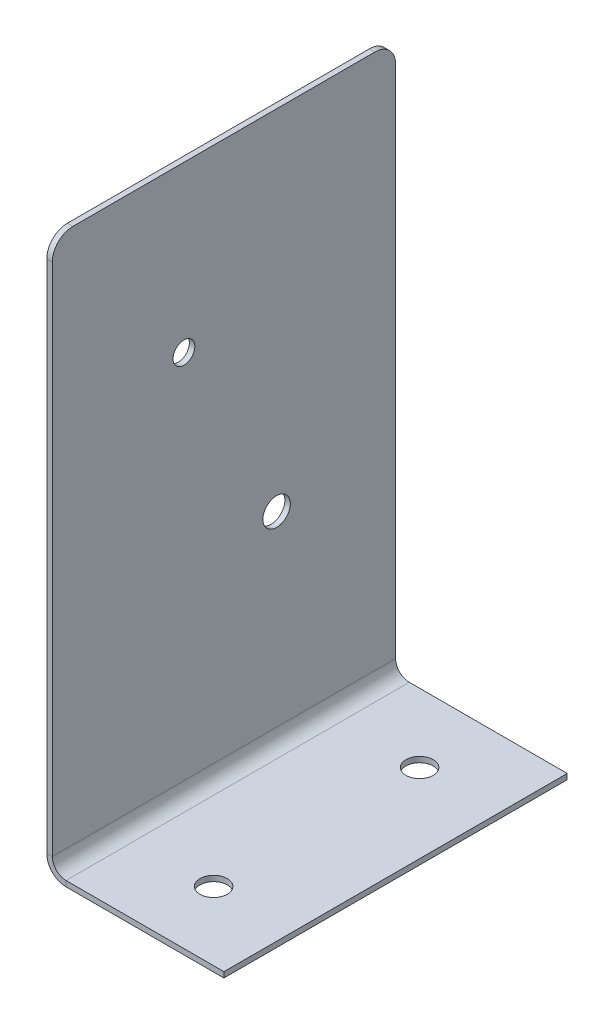
ISO-10303-21;
HEADER;
FILE_DESCRIPTION(('STEP AP214'),'2;1');
FILE_NAME('part.step','',(''),(''),'','','');
FILE_SCHEMA(('AUTOMOTIVE_DESIGN { 1 0 10303 214 1 1 1 1 }'));
ENDSEC;
DATA;
#1=APPLICATION_CONTEXT('core data for automotive mechanical design processes');
#2=APPLICATION_PROTOCOL_DEFINITION('international standard','automotive_design',2000,#1);
#3=PRODUCT_CONTEXT('',#1,'mechanical');
#4=PRODUCT('Part','Part','',(#3));
#5=PRODUCT_RELATED_PRODUCT_CATEGORY('part','',(#4));
#6=PRODUCT_DEFINITION_FORMATION('','',#4);
#7=PRODUCT_DEFINITION_CONTEXT('part definition',#1,'design');
#8=PRODUCT_DEFINITION('design','',#6,#7);
#9=PRODUCT_DEFINITION_SHAPE('','',#8);
#10=(LENGTH_UNIT() NAMED_UNIT(*) SI_UNIT(.MILLI.,.METRE.));
#11=(NAMED_UNIT(*) PLANE_ANGLE_UNIT() SI_UNIT($,.RADIAN.));
#12=(NAMED_UNIT(*) SI_UNIT($,.STERADIAN.) SOLID_ANGLE_UNIT());
#13=UNCERTAINTY_MEASURE_WITH_UNIT(LENGTH_MEASURE(1.E-05),#10,'distance_accuracy_value','');
#14=(GEOMETRIC_REPRESENTATION_CONTEXT(3) GLOBAL_UNCERTAINTY_ASSIGNED_CONTEXT((#13)) GLOBAL_UNIT_ASSIGNED_CONTEXT((#10,
#11,#12)) REPRESENTATION_CONTEXT('',''));
#15=CARTESIAN_POINT('',(0.,0.,0.));
#16=DIRECTION('',(0.,0.,1.));
#17=DIRECTION('',(1.,0.,0.));
#18=AXIS2_PLACEMENT_3D('',#15,#16,#17);
#19=CARTESIAN_POINT('',(2.,0.,25.));
#20=DIRECTION('',(0.,0.,1.));
#21=DIRECTION('',(1.,0.,0.));
#22=AXIS2_PLACEMENT_3D('',#19,#20,#21);
#23=PLANE('',#22);
#24=DIRECTION('',(0.,-1.,0.));
#25=VECTOR('',#24,1.);
#26=CARTESIAN_POINT('',(2.,0.,25.));
#27=LINE('',#26,#25);
#28=CARTESIAN_POINT('',(2.,0.,25.));
#29=VERTEX_POINT('',#28);
#30=CARTESIAN_POINT('',(2.,-0.8,25.));
#31=VERTEX_POINT('',#30);
#32=EDGE_CURVE('E197',#29,#31,#27,.T.);
#33=ORIENTED_EDGE('',*,*,#32,.F.);
#34=CARTESIAN_POINT('',(2.,2.,25.));
#35=DIRECTION('',(0.,0.,-1.));
#36=DIRECTION('',(-1.,0.,0.));
#37=AXIS2_PLACEMENT_3D('',#34,#35,#36);
#38=CIRCLE('',#37,2.);
#39=CARTESIAN_POINT('',(0.,2.,25.));
#40=VERTEX_POINT('',#39);
#41=EDGE_CURVE('E165',#40,#29,#38,.F.);
#42=ORIENTED_EDGE('',*,*,#41,.F.);
#43=DIRECTION('',(1.,0.,0.));
#44=VECTOR('',#43,1.);
#45=CARTESIAN_POINT('',(-0.799999999999995,2.,25.));
#46=LINE('',#45,#44);
#47=CARTESIAN_POINT('',(-0.799999999999995,2.,25.));
#48=VERTEX_POINT('',#47);
#49=EDGE_CURVE('E194',#48,#40,#46,.T.);
#50=ORIENTED_EDGE('',*,*,#49,.F.);
#51=CARTESIAN_POINT('',(2.,2.,25.));
#52=DIRECTION('',(0.,0.,1.));
#53=DIRECTION('',(1.,0.,0.));
#54=AXIS2_PLACEMENT_3D('',#51,#52,#53);
#55=CIRCLE('',#54,2.8);
#56=EDGE_CURVE('E172',#48,#31,#55,.T.);
#57=ORIENTED_EDGE('',*,*,#56,.T.);
#58=EDGE_LOOP('',(#33,#42,#50,#57));
#59=FACE_BOUND('',#58,.T.);
#60=ADVANCED_FACE('F38',(#59),#23,.T.);
#61=CARTESIAN_POINT('',(-0.799999999999995,2.,25.));
#62=DIRECTION('',(0.,0.,1.));
#63=DIRECTION('',(1.,0.,0.));
#64=AXIS2_PLACEMENT_3D('',#61,#62,#63);
#65=PLANE('',#64);
#66=DIRECTION('',(1.,0.,0.));
#67=VECTOR('',#66,1.);
#68=CARTESIAN_POINT('',(0.,0.,25.));
#69=LINE('',#68,#67);
#70=CARTESIAN_POINT('',(25.,0.,25.));
#71=VERTEX_POINT('',#70);
#72=EDGE_CURVE('E162',#29,#71,#69,.T.);
#73=ORIENTED_EDGE('',*,*,#72,.F.);
#74=ORIENTED_EDGE('',*,*,#32,.T.);
#75=DIRECTION('',(1.,0.,0.));
#76=VECTOR('',#75,1.);
#77=CARTESIAN_POINT('',(0.,-0.8,25.));
#78=LINE('',#77,#76);
#79=CARTESIAN_POINT('',(25.,-0.8,25.));
#80=VERTEX_POINT('',#79);
#81=EDGE_CURVE('E159',#31,#80,#78,.T.);
#82=ORIENTED_EDGE('',*,*,#81,.T.);
#83=DIRECTION('',(0.,-1.,0.));
#84=VECTOR('',#83,1.);
#85=CARTESIAN_POINT('',(25.,0.,25.));
#86=LINE('',#85,#84);
#87=EDGE_CURVE('E122',#71,#80,#86,.T.);
#88=ORIENTED_EDGE('',*,*,#87,.F.);
#89=EDGE_LOOP('',(#73,#74,#82,#88));
#90=FACE_BOUND('',#89,.T.);
#91=ADVANCED_FACE('F244',(#90),#65,.T.);
#92=CARTESIAN_POINT('',(0.,2.,-25.));
#93=DIRECTION('',(0.,0.,-1.));
#94=DIRECTION('',(-1.,0.,0.));
#95=AXIS2_PLACEMENT_3D('',#92,#93,#94);
#96=PLANE('',#95);
#97=DIRECTION('',(-1.,0.,0.));
#98=VECTOR('',#97,1.);
#99=CARTESIAN_POINT('',(0.,2.,-25.));
#100=LINE('',#99,#98);
#101=CARTESIAN_POINT('',(0.,2.,-25.));
#102=VERTEX_POINT('',#101);
#103=CARTESIAN_POINT('',(-0.800000000000002,2.,-25.));
#104=VERTEX_POINT('',#103);
#105=EDGE_CURVE('E191',#102,#104,#100,.T.);
#106=ORIENTED_EDGE('',*,*,#105,.F.);
#107=CARTESIAN_POINT('',(2.,2.,-25.));
#108=DIRECTION('',(0.,0.,-1.));
#109=DIRECTION('',(-1.,0.,0.));
#110=AXIS2_PLACEMENT_3D('',#107,#108,#109);
#111=CIRCLE('',#110,2.);
#112=CARTESIAN_POINT('',(2.,0.,-25.));
#113=VERTEX_POINT('',#112);
#114=EDGE_CURVE('E150',#102,#113,#111,.F.);
#115=ORIENTED_EDGE('',*,*,#114,.T.);
#116=DIRECTION('',(0.,1.,0.));
#117=VECTOR('',#116,1.);
#118=CARTESIAN_POINT('',(2.,-0.8,-25.));
#119=LINE('',#118,#117);
#120=CARTESIAN_POINT('',(2.,-0.8,-25.));
#121=VERTEX_POINT('',#120);
#122=EDGE_CURVE('E126',#121,#113,#119,.T.);
#123=ORIENTED_EDGE('',*,*,#122,.F.);
#124=CARTESIAN_POINT('',(2.,2.,-25.));
#125=DIRECTION('',(0.,0.,1.));
#126=DIRECTION('',(1.,0.,0.));
#127=AXIS2_PLACEMENT_3D('',#124,#125,#126);
#128=CIRCLE('',#127,2.8);
#129=EDGE_CURVE('E157',#104,#121,#128,.T.);
#130=ORIENTED_EDGE('',*,*,#129,.F.);
#131=EDGE_LOOP('',(#106,#115,#123,#130));
#132=FACE_BOUND('',#131,.T.);
#133=ADVANCED_FACE('F246',(#132),#96,.T.);
#134=CARTESIAN_POINT('',(2.,-0.8,-25.));
#135=DIRECTION('',(0.,0.,-1.));
#136=DIRECTION('',(-1.,0.,0.));
#137=AXIS2_PLACEMENT_3D('',#134,#135,#136);
#138=PLANE('',#137);
#139=DIRECTION('',(0.,-1.,0.));
#140=VECTOR('',#139,1.);
#141=CARTESIAN_POINT('',(-0.800000000000002,80.,-25.));
#142=LINE('',#141,#140);
#143=CARTESIAN_POINT('',(-0.800000000000009,77.,-25.0000000000001));
#144=VERTEX_POINT('',#143);
#145=EDGE_CURVE('E155',#144,#104,#142,.T.);
#146=ORIENTED_EDGE('',*,*,#145,.F.);
#147=DIRECTION('',(1.,0.,0.));
#148=VECTOR('',#147,1.);
#149=CARTESIAN_POINT('',(2.,77.,-25.0000000000001));
#150=LINE('',#149,#148);
#151=CARTESIAN_POINT('',(0.,77.,-25.0000000000001));
#152=VERTEX_POINT('',#151);
#153=EDGE_CURVE('E199',#144,#152,#150,.T.);
#154=ORIENTED_EDGE('',*,*,#153,.T.);
#155=DIRECTION('',(0.,-1.,0.));
#156=VECTOR('',#155,1.);
#157=CARTESIAN_POINT('',(0.,80.,-25.));
#158=LINE('',#157,#156);
#159=EDGE_CURVE('E153',#152,#102,#158,.T.);
#160=ORIENTED_EDGE('',*,*,#159,.T.);
#161=ORIENTED_EDGE('',*,*,#105,.T.);
#162=EDGE_LOOP('',(#146,#154,#160,#161));
#163=FACE_BOUND('',#162,.T.);
#164=ADVANCED_FACE('F219',(#163),#138,.T.);
#165=CARTESIAN_POINT('',(0.,-0.8,25.));
#166=DIRECTION('',(0.,1.,0.));
#167=DIRECTION('',(0.,0.,1.));
#168=AXIS2_PLACEMENT_3D('',#165,#166,#167);
#169=PLANE('',#168);
#170=CARTESIAN_POINT('',(13.5,-0.800000000000001,15.));
#171=DIRECTION('',(0.,1.,0.));
#172=DIRECTION('',(0.,0.,1.));
#173=AXIS2_PLACEMENT_3D('',#170,#171,#172);
#174=CIRCLE('',#173,1.984375);
#175=CARTESIAN_POINT('',(13.5,-0.800000000000001,16.984375));
#176=VERTEX_POINT('',#175);
#177=EDGE_CURVE('E460',#176,#176,#174,.T.);
#178=ORIENTED_EDGE('',*,*,#177,.T.);
#179=EDGE_LOOP('',(#178));
#180=FACE_BOUND('',#179,.T.);
#181=CARTESIAN_POINT('',(13.5,-0.8,-15.));
#182=DIRECTION('',(0.,1.,0.));
#183=DIRECTION('',(0.,0.,1.));
#184=AXIS2_PLACEMENT_3D('',#181,#182,#183);
#185=CIRCLE('',#184,1.984375);
#186=CARTESIAN_POINT('',(13.5,-0.8,-13.015625));
#187=VERTEX_POINT('',#186);
#188=EDGE_CURVE('E463',#187,#187,#185,.T.);
#189=ORIENTED_EDGE('',*,*,#188,.T.);
#190=EDGE_LOOP('',(#189));
#191=FACE_BOUND('',#190,.T.);
#192=DIRECTION('',(0.,0.,-1.));
#193=VECTOR('',#192,1.);
#194=CARTESIAN_POINT('',(2.,-0.8,25.));
#195=LINE('',#194,#193);
#196=EDGE_CURVE('E141',#31,#121,#195,.T.);
#197=ORIENTED_EDGE('',*,*,#196,.T.);
#198=DIRECTION('',(1.,0.,0.));
#199=VECTOR('',#198,1.);
#200=CARTESIAN_POINT('',(0.,-0.8,-25.));
#201=LINE('',#200,#199);
#202=CARTESIAN_POINT('',(25.,-0.8,-25.));
#203=VERTEX_POINT('',#202);
#204=EDGE_CURVE('E133',#121,#203,#201,.T.);
#205=ORIENTED_EDGE('',*,*,#204,.T.);
#206=DIRECTION('',(0.,0.,-1.));
#207=VECTOR('',#206,1.);
#208=CARTESIAN_POINT('',(25.,-0.8,25.));
#209=LINE('',#208,#207);
#210=EDGE_CURVE('E117',#80,#203,#209,.T.);
#211=ORIENTED_EDGE('',*,*,#210,.F.);
#212=ORIENTED_EDGE('',*,*,#81,.F.);
#213=EDGE_LOOP('',(#197,#205,#211,#212));
#214=FACE_BOUND('',#213,.T.);
#215=ADVANCED_FACE('F139',(#180,#191,#214),#169,.F.);
#216=CARTESIAN_POINT('',(25.,0.,25.));
#217=DIRECTION('',(1.,0.,0.));
#218=DIRECTION('',(0.,0.,-1.));
#219=AXIS2_PLACEMENT_3D('',#216,#217,#218);
#220=PLANE('',#219);
#221=ORIENTED_EDGE('',*,*,#210,.T.);
#222=DIRECTION('',(0.,-1.,0.));
#223=VECTOR('',#222,1.);
#224=CARTESIAN_POINT('',(25.,0.,-25.0000000000001));
#225=LINE('',#224,#223);
#226=CARTESIAN_POINT('',(25.,0.,-25.0000000000001));
#227=VERTEX_POINT('',#226);
#228=EDGE_CURVE('E120',#227,#203,#225,.T.);
#229=ORIENTED_EDGE('',*,*,#228,.F.);
#230=DIRECTION('',(0.,0.,-1.));
#231=VECTOR('',#230,1.);
#232=CARTESIAN_POINT('',(25.,0.,25.));
#233=LINE('',#232,#231);
#234=EDGE_CURVE('E127',#71,#227,#233,.T.);
#235=ORIENTED_EDGE('',*,*,#234,.F.);
#236=ORIENTED_EDGE('',*,*,#87,.T.);
#237=EDGE_LOOP('',(#221,#229,#235,#236));
#238=FACE_BOUND('',#237,.T.);
#239=ADVANCED_FACE('F119',(#238),#220,.T.);
#240=CARTESIAN_POINT('',(0.,0.,25.));
#241=DIRECTION('',(0.,1.,0.));
#242=DIRECTION('',(0.,0.,1.));
#243=AXIS2_PLACEMENT_3D('',#240,#241,#242);
#244=PLANE('',#243);
#245=CARTESIAN_POINT('',(13.5,0.,15.));
#246=DIRECTION('',(0.,1.,0.));
#247=DIRECTION('',(0.,0.,1.));
#248=AXIS2_PLACEMENT_3D('',#245,#246,#247);
#249=CIRCLE('',#248,1.984375);
#250=CARTESIAN_POINT('',(13.5,0.,16.984375));
#251=VERTEX_POINT('',#250);
#252=EDGE_CURVE('E486',#251,#251,#249,.T.);
#253=ORIENTED_EDGE('',*,*,#252,.F.);
#254=EDGE_LOOP('',(#253));
#255=FACE_BOUND('',#254,.T.);
#256=CARTESIAN_POINT('',(13.5,0.,-15.));
#257=DIRECTION('',(0.,1.,0.));
#258=DIRECTION('',(0.,0.,1.));
#259=AXIS2_PLACEMENT_3D('',#256,#257,#258);
#260=CIRCLE('',#259,1.984375);
#261=CARTESIAN_POINT('',(13.5,0.,-13.015625));
#262=VERTEX_POINT('',#261);
#263=EDGE_CURVE('E466',#262,#262,#260,.T.);
#264=ORIENTED_EDGE('',*,*,#263,.F.);
#265=EDGE_LOOP('',(#264));
#266=FACE_BOUND('',#265,.T.);
#267=ORIENTED_EDGE('',*,*,#234,.T.);
#268=DIRECTION('',(1.,0.,0.));
#269=VECTOR('',#268,1.);
#270=CARTESIAN_POINT('',(0.,0.,-25.));
#271=LINE('',#270,#269);
#272=EDGE_CURVE('E136',#113,#227,#271,.T.);
#273=ORIENTED_EDGE('',*,*,#272,.F.);
#274=DIRECTION('',(0.,0.,-1.));
#275=VECTOR('',#274,1.);
#276=CARTESIAN_POINT('',(2.,0.,25.));
#277=LINE('',#276,#275);
#278=EDGE_CURVE('E186',#29,#113,#277,.T.);
#279=ORIENTED_EDGE('',*,*,#278,.F.);
#280=ORIENTED_EDGE('',*,*,#72,.T.);
#281=EDGE_LOOP('',(#267,#273,#279,#280));
#282=FACE_BOUND('',#281,.T.);
#283=ADVANCED_FACE('F243',(#255,#266,#282),#244,.T.);
#284=CARTESIAN_POINT('',(2.,2.,25.));
#285=DIRECTION('',(0.,0.,-1.));
#286=DIRECTION('',(-1.,0.,0.));
#287=AXIS2_PLACEMENT_3D('',#284,#285,#286);
#288=CYLINDRICAL_SURFACE('',#287,2.);
#289=ORIENTED_EDGE('',*,*,#278,.T.);
#290=ORIENTED_EDGE('',*,*,#114,.F.);
#291=DIRECTION('',(0.,0.,-1.));
#292=VECTOR('',#291,1.);
#293=CARTESIAN_POINT('',(0.,2.,25.));
#294=LINE('',#293,#292);
#295=EDGE_CURVE('E183',#40,#102,#294,.T.);
#296=ORIENTED_EDGE('',*,*,#295,.F.);
#297=ORIENTED_EDGE('',*,*,#41,.T.);
#298=EDGE_LOOP('',(#289,#290,#296,#297));
#299=FACE_BOUND('',#298,.T.);
#300=ADVANCED_FACE('F237',(#299),#288,.F.);
#301=CARTESIAN_POINT('',(0.,80.,25.0000000000001));
#302=DIRECTION('',(1.,0.,0.));
#303=DIRECTION('',(0.,1.,0.));
#304=AXIS2_PLACEMENT_3D('',#301,#302,#303);
#305=PLANE('',#304);
#306=CARTESIAN_POINT('',(0.,29.2,-7.67597901866867));
#307=DIRECTION('',(1.,0.,0.));
#308=DIRECTION('',(0.,1.,0.));
#309=AXIS2_PLACEMENT_3D('',#306,#307,#308);
#310=CIRCLE('',#309,2.);
#311=CARTESIAN_POINT('',(0.,31.2,-7.67597901866867));
#312=VERTEX_POINT('',#311);
#313=EDGE_CURVE('E465',#312,#312,#310,.T.);
#314=ORIENTED_EDGE('',*,*,#313,.F.);
#315=EDGE_LOOP('',(#314));
#316=FACE_BOUND('',#315,.T.);
#317=CARTESIAN_POINT('',(0.,55.9908566492376,5.82402098133134));
#318=DIRECTION('',(1.,0.,0.));
#319=DIRECTION('',(0.,1.,0.));
#320=AXIS2_PLACEMENT_3D('',#317,#318,#319);
#321=CIRCLE('',#320,1.5875);
#322=CARTESIAN_POINT('',(0.,57.5783566492376,5.82402098133134));
#323=VERTEX_POINT('',#322);
#324=EDGE_CURVE('E145',#323,#323,#321,.T.);
#325=ORIENTED_EDGE('',*,*,#324,.F.);
#326=EDGE_LOOP('',(#325));
#327=FACE_BOUND('',#326,.T.);
#328=ORIENTED_EDGE('',*,*,#159,.F.);
#329=CARTESIAN_POINT('',(0.,77.,-22.));
#330=DIRECTION('',(1.,0.,0.));
#331=DIRECTION('',(0.,1.,0.));
#332=AXIS2_PLACEMENT_3D('',#329,#330,#331);
#333=CIRCLE('',#332,3.);
#334=CARTESIAN_POINT('',(0.,80.,-22.));
#335=VERTEX_POINT('',#334);
#336=EDGE_CURVE('E204',#152,#335,#333,.T.);
#337=ORIENTED_EDGE('',*,*,#336,.T.);
#338=DIRECTION('',(0.,0.,-1.));
#339=VECTOR('',#338,1.);
#340=CARTESIAN_POINT('',(0.,80.,25.0000000000001));
#341=LINE('',#340,#339);
#342=CARTESIAN_POINT('',(0.,80.,22.));
#343=VERTEX_POINT('',#342);
#344=EDGE_CURVE('E181',#343,#335,#341,.T.);
#345=ORIENTED_EDGE('',*,*,#344,.F.);
#346=CARTESIAN_POINT('',(0.,77.,22.));
#347=DIRECTION('',(1.,0.,0.));
#348=DIRECTION('',(0.,1.,0.));
#349=AXIS2_PLACEMENT_3D('',#346,#347,#348);
#350=CIRCLE('',#349,3.);
#351=CARTESIAN_POINT('',(0.,77.,25.));
#352=VERTEX_POINT('',#351);
#353=EDGE_CURVE('E202',#343,#352,#350,.T.);
#354=ORIENTED_EDGE('',*,*,#353,.T.);
#355=DIRECTION('',(0.,-1.,0.));
#356=VECTOR('',#355,1.);
#357=CARTESIAN_POINT('',(0.,80.,25.0000000000001));
#358=LINE('',#357,#356);
#359=EDGE_CURVE('E168',#352,#40,#358,.T.);
#360=ORIENTED_EDGE('',*,*,#359,.T.);
#361=ORIENTED_EDGE('',*,*,#295,.T.);
#362=EDGE_LOOP('',(#328,#337,#345,#354,#360,#361));
#363=FACE_BOUND('',#362,.T.);
#364=ADVANCED_FACE('F225',(#316,#327,#363),#305,.T.);
#365=CARTESIAN_POINT('',(-0.800000000000009,80.,25.));
#366=DIRECTION('',(0.,1.,0.));
#367=DIRECTION('',(0.,0.,1.));
#368=AXIS2_PLACEMENT_3D('',#365,#366,#367);
#369=PLANE('',#368);
#370=ORIENTED_EDGE('',*,*,#344,.T.);
#371=DIRECTION('',(1.,0.,0.));
#372=VECTOR('',#371,1.);
#373=CARTESIAN_POINT('',(-0.800000000000002,80.,-22.));
#374=LINE('',#373,#372);
#375=CARTESIAN_POINT('',(-0.800000000000002,80.,-22.));
#376=VERTEX_POINT('',#375);
#377=EDGE_CURVE('E59',#335,#376,#374,.F.);
#378=ORIENTED_EDGE('',*,*,#377,.T.);
#379=DIRECTION('',(0.,0.,-1.));
#380=VECTOR('',#379,1.);
#381=CARTESIAN_POINT('',(-0.800000000000009,80.,25.));
#382=LINE('',#381,#380);
#383=CARTESIAN_POINT('',(-0.800000000000009,80.,22.));
#384=VERTEX_POINT('',#383);
#385=EDGE_CURVE('E179',#384,#376,#382,.T.);
#386=ORIENTED_EDGE('',*,*,#385,.F.);
#387=DIRECTION('',(1.,0.,0.));
#388=VECTOR('',#387,1.);
#389=CARTESIAN_POINT('',(0.,80.,22.));
#390=LINE('',#389,#388);
#391=EDGE_CURVE('E206',#384,#343,#390,.T.);
#392=ORIENTED_EDGE('',*,*,#391,.T.);
#393=EDGE_LOOP('',(#370,#378,#386,#392));
#394=FACE_BOUND('',#393,.T.);
#395=ADVANCED_FACE('F226',(#394),#369,.T.);
#396=CARTESIAN_POINT('',(-0.800000000000009,80.,25.));
#397=DIRECTION('',(1.,0.,0.));
#398=DIRECTION('',(0.,1.,0.));
#399=AXIS2_PLACEMENT_3D('',#396,#397,#398);
#400=PLANE('',#399);
#401=CARTESIAN_POINT('',(-0.800000000000009,29.2,-7.67597901866867));
#402=DIRECTION('',(1.,0.,0.));
#403=DIRECTION('',(0.,1.,0.));
#404=AXIS2_PLACEMENT_3D('',#401,#402,#403);
#405=CIRCLE('',#404,2.);
#406=CARTESIAN_POINT('',(-0.800000000000009,31.2,-7.67597901866867));
#407=VERTEX_POINT('',#406);
#408=EDGE_CURVE('E469',#407,#407,#405,.T.);
#409=ORIENTED_EDGE('',*,*,#408,.T.);
#410=EDGE_LOOP('',(#409));
#411=FACE_BOUND('',#410,.T.);
#412=CARTESIAN_POINT('',(-0.800000000000016,55.9908566492376,5.82402098133134));
#413=DIRECTION('',(1.,0.,0.));
#414=DIRECTION('',(0.,1.,0.));
#415=AXIS2_PLACEMENT_3D('',#412,#413,#414);
#416=CIRCLE('',#415,1.5875);
#417=CARTESIAN_POINT('',(-0.800000000000016,57.5783566492376,5.82402098133134));
#418=VERTEX_POINT('',#417);
#419=EDGE_CURVE('E142',#418,#418,#416,.T.);
#420=ORIENTED_EDGE('',*,*,#419,.T.);
#421=EDGE_LOOP('',(#420));
#422=FACE_BOUND('',#421,.T.);
#423=ORIENTED_EDGE('',*,*,#385,.T.);
#424=CARTESIAN_POINT('',(-0.800000000000009,77.,-22.));
#425=DIRECTION('',(1.,0.,0.));
#426=DIRECTION('',(0.,1.,0.));
#427=AXIS2_PLACEMENT_3D('',#424,#425,#426);
#428=CIRCLE('',#427,3.);
#429=EDGE_CURVE('E46',#376,#144,#428,.F.);
#430=ORIENTED_EDGE('',*,*,#429,.T.);
#431=ORIENTED_EDGE('',*,*,#145,.T.);
#432=DIRECTION('',(0.,0.,-1.));
#433=VECTOR('',#432,1.);
#434=CARTESIAN_POINT('',(-0.799999999999995,2.,25.));
#435=LINE('',#434,#433);
#436=EDGE_CURVE('E176',#48,#104,#435,.T.);
#437=ORIENTED_EDGE('',*,*,#436,.F.);
#438=DIRECTION('',(0.,-1.,0.));
#439=VECTOR('',#438,1.);
#440=CARTESIAN_POINT('',(-0.800000000000009,80.,25.));
#441=LINE('',#440,#439);
#442=CARTESIAN_POINT('',(-0.800000000000002,77.,25.));
#443=VERTEX_POINT('',#442);
#444=EDGE_CURVE('E170',#443,#48,#441,.T.);
#445=ORIENTED_EDGE('',*,*,#444,.F.);
#446=CARTESIAN_POINT('',(-0.800000000000002,77.,22.));
#447=DIRECTION('',(1.,0.,0.));
#448=DIRECTION('',(0.,1.,0.));
#449=AXIS2_PLACEMENT_3D('',#446,#447,#448);
#450=CIRCLE('',#449,3.);
#451=EDGE_CURVE('E210',#443,#384,#450,.F.);
#452=ORIENTED_EDGE('',*,*,#451,.T.);
#453=EDGE_LOOP('',(#423,#430,#431,#437,#445,#452));
#454=FACE_BOUND('',#453,.T.);
#455=ADVANCED_FACE('F214',(#411,#422,#454),#400,.F.);
#456=CARTESIAN_POINT('',(2.,2.,25.));
#457=DIRECTION('',(0.,0.,-1.));
#458=DIRECTION('',(-1.,0.,0.));
#459=AXIS2_PLACEMENT_3D('',#456,#457,#458);
#460=CYLINDRICAL_SURFACE('',#459,2.8);
#461=ORIENTED_EDGE('',*,*,#436,.T.);
#462=ORIENTED_EDGE('',*,*,#129,.T.);
#463=ORIENTED_EDGE('',*,*,#196,.F.);
#464=ORIENTED_EDGE('',*,*,#56,.F.);
#465=EDGE_LOOP('',(#461,#462,#463,#464));
#466=FACE_BOUND('',#465,.T.);
#467=ADVANCED_FACE('F285',(#466),#460,.T.);
#468=CARTESIAN_POINT('',(2.,2.,25.));
#469=DIRECTION('',(0.,0.,-1.));
#470=DIRECTION('',(-1.,0.,0.));
#471=AXIS2_PLACEMENT_3D('',#468,#469,#470);
#472=PLANE('',#471);
#473=ORIENTED_EDGE('',*,*,#359,.F.);
#474=DIRECTION('',(1.,0.,0.));
#475=VECTOR('',#474,1.);
#476=CARTESIAN_POINT('',(-0.800000000000002,77.,25.));
#477=LINE('',#476,#475);
#478=EDGE_CURVE('E11',#352,#443,#477,.F.);
#479=ORIENTED_EDGE('',*,*,#478,.T.);
#480=ORIENTED_EDGE('',*,*,#444,.T.);
#481=ORIENTED_EDGE('',*,*,#49,.T.);
#482=EDGE_LOOP('',(#473,#479,#480,#481));
#483=FACE_BOUND('',#482,.T.);
#484=ADVANCED_FACE('F230',(#483),#472,.F.);
#485=CARTESIAN_POINT('',(2.,2.,-25.));
#486=DIRECTION('',(0.,0.,-1.));
#487=DIRECTION('',(-1.,0.,0.));
#488=AXIS2_PLACEMENT_3D('',#485,#486,#487);
#489=PLANE('',#488);
#490=ORIENTED_EDGE('',*,*,#204,.F.);
#491=ORIENTED_EDGE('',*,*,#122,.T.);
#492=ORIENTED_EDGE('',*,*,#272,.T.);
#493=ORIENTED_EDGE('',*,*,#228,.T.);
#494=EDGE_LOOP('',(#490,#491,#492,#493));
#495=FACE_BOUND('',#494,.T.);
#496=ADVANCED_FACE('F132',(#495),#489,.T.);
#497=CARTESIAN_POINT('',(-0.800000000000016,55.9908566492376,5.82402098133134));
#498=DIRECTION('',(1.,0.,0.));
#499=DIRECTION('',(0.,1.,0.));
#500=AXIS2_PLACEMENT_3D('',#497,#498,#499);
#501=CYLINDRICAL_SURFACE('',#500,1.5875);
#502=ORIENTED_EDGE('',*,*,#419,.F.);
#503=EDGE_LOOP('',(#502));
#504=FACE_BOUND('',#503,.T.);
#505=ORIENTED_EDGE('',*,*,#324,.T.);
#506=EDGE_LOOP('',(#505));
#507=FACE_BOUND('',#506,.T.);
#508=ADVANCED_FACE('F276',(#504,#507),#501,.F.);
#509=CARTESIAN_POINT('',(-0.800000000000009,29.2,-7.67597901866867));
#510=DIRECTION('',(1.,0.,0.));
#511=DIRECTION('',(0.,1.,0.));
#512=AXIS2_PLACEMENT_3D('',#509,#510,#511);
#513=CYLINDRICAL_SURFACE('',#512,2.);
#514=ORIENTED_EDGE('',*,*,#408,.F.);
#515=EDGE_LOOP('',(#514));
#516=FACE_BOUND('',#515,.T.);
#517=ORIENTED_EDGE('',*,*,#313,.T.);
#518=EDGE_LOOP('',(#517));
#519=FACE_BOUND('',#518,.T.);
#520=ADVANCED_FACE('F268',(#516,#519),#513,.F.);
#521=CARTESIAN_POINT('',(13.5,-10.,-15.));
#522=DIRECTION('',(0.,1.,0.));
#523=DIRECTION('',(0.,0.,1.));
#524=AXIS2_PLACEMENT_3D('',#521,#522,#523);
#525=CYLINDRICAL_SURFACE('',#524,1.984375);
#526=ORIENTED_EDGE('',*,*,#263,.T.);
#527=EDGE_LOOP('',(#526));
#528=FACE_BOUND('',#527,.T.);
#529=ORIENTED_EDGE('',*,*,#188,.F.);
#530=EDGE_LOOP('',(#529));
#531=FACE_BOUND('',#530,.T.);
#532=ADVANCED_FACE('F262',(#528,#531),#525,.F.);
#533=CARTESIAN_POINT('',(13.5,-10.,15.));
#534=DIRECTION('',(0.,1.,0.));
#535=DIRECTION('',(0.,0.,1.));
#536=AXIS2_PLACEMENT_3D('',#533,#534,#535);
#537=CYLINDRICAL_SURFACE('',#536,1.984375);
#538=ORIENTED_EDGE('',*,*,#252,.T.);
#539=EDGE_LOOP('',(#538));
#540=FACE_BOUND('',#539,.T.);
#541=ORIENTED_EDGE('',*,*,#177,.F.);
#542=EDGE_LOOP('',(#541));
#543=FACE_BOUND('',#542,.T.);
#544=ADVANCED_FACE('F257',(#540,#543),#537,.F.);
#545=CARTESIAN_POINT('',(2.,77.,-22.));
#546=DIRECTION('',(1.,0.,0.));
#547=DIRECTION('',(0.,0.,-1.));
#548=AXIS2_PLACEMENT_3D('',#545,#546,#547);
#549=CYLINDRICAL_SURFACE('',#548,3.);
#550=ORIENTED_EDGE('',*,*,#429,.F.);
#551=ORIENTED_EDGE('',*,*,#377,.F.);
#552=ORIENTED_EDGE('',*,*,#336,.F.);
#553=ORIENTED_EDGE('',*,*,#153,.F.);
#554=EDGE_LOOP('',(#550,#551,#552,#553));
#555=FACE_BOUND('',#554,.T.);
#556=ADVANCED_FACE('F222',(#555),#549,.T.);
#557=CARTESIAN_POINT('',(-0.800000000000002,77.,22.));
#558=DIRECTION('',(-1.,0.,0.));
#559=DIRECTION('',(0.,0.,1.));
#560=AXIS2_PLACEMENT_3D('',#557,#558,#559);
#561=CYLINDRICAL_SURFACE('',#560,3.);
#562=ORIENTED_EDGE('',*,*,#451,.F.);
#563=ORIENTED_EDGE('',*,*,#478,.F.);
#564=ORIENTED_EDGE('',*,*,#353,.F.);
#565=ORIENTED_EDGE('',*,*,#391,.F.);
#566=EDGE_LOOP('',(#562,#563,#564,#565));
#567=FACE_BOUND('',#566,.T.);
#568=ADVANCED_FACE('F40',(#567),#561,.T.);
#569=CLOSED_SHELL('',(#60,#91,#133,#164,#215,#239,#283,#300,#364,#395,#455,#467,#484,#496,#508,
#520,#532,#544,#556,#568));
#570=MANIFOLD_SOLID_BREP('B2',#569);
#571=ADVANCED_BREP_SHAPE_REPRESENTATION('',(#18,#570),#14);
#572=SHAPE_DEFINITION_REPRESENTATION(#9,#571);
ENDSEC;
END-ISO-10303-21;
